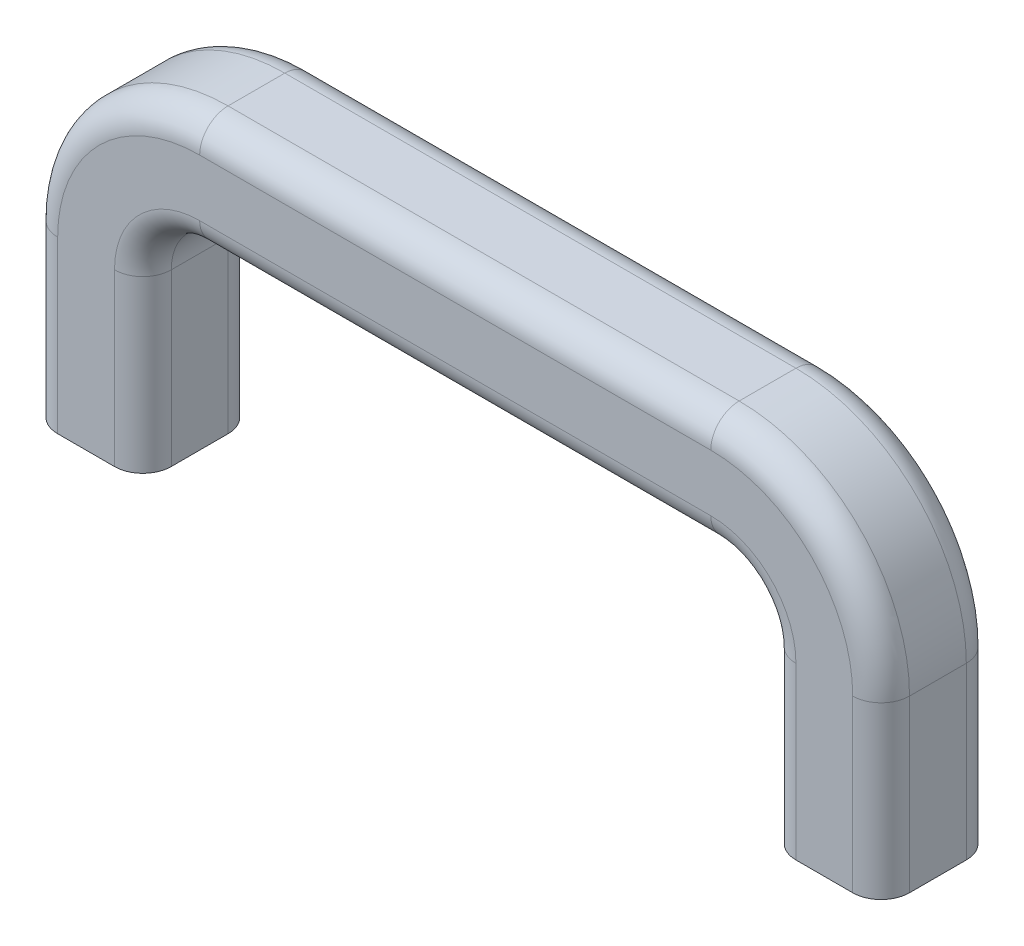
ISO-10303-21;
HEADER;
FILE_DESCRIPTION(('STEP AP214'),'2;1');
FILE_NAME('part.step','',(''),(''),'','','');
FILE_SCHEMA(('AUTOMOTIVE_DESIGN { 1 0 10303 214 1 1 1 1 }'));
ENDSEC;
DATA;
#1=APPLICATION_CONTEXT('core data for automotive mechanical design processes');
#2=APPLICATION_PROTOCOL_DEFINITION('international standard','automotive_design',2000,#1);
#3=PRODUCT_CONTEXT('',#1,'mechanical');
#4=PRODUCT('Part','Part','',(#3));
#5=PRODUCT_RELATED_PRODUCT_CATEGORY('part','',(#4));
#6=PRODUCT_DEFINITION_FORMATION('','',#4);
#7=PRODUCT_DEFINITION_CONTEXT('part definition',#1,'design');
#8=PRODUCT_DEFINITION('design','',#6,#7);
#9=PRODUCT_DEFINITION_SHAPE('','',#8);
#10=(LENGTH_UNIT() NAMED_UNIT(*) SI_UNIT(.MILLI.,.METRE.));
#11=(NAMED_UNIT(*) PLANE_ANGLE_UNIT() SI_UNIT($,.RADIAN.));
#12=(NAMED_UNIT(*) SI_UNIT($,.STERADIAN.) SOLID_ANGLE_UNIT());
#13=UNCERTAINTY_MEASURE_WITH_UNIT(LENGTH_MEASURE(1.E-05),#10,'distance_accuracy_value','');
#14=(GEOMETRIC_REPRESENTATION_CONTEXT(3) GLOBAL_UNCERTAINTY_ASSIGNED_CONTEXT((#13)) GLOBAL_UNIT_ASSIGNED_CONTEXT((#10,
#11,#12)) REPRESENTATION_CONTEXT('',''));
#15=CARTESIAN_POINT('',(0.,0.,0.));
#16=DIRECTION('',(0.,0.,1.));
#17=DIRECTION('',(1.,0.,0.));
#18=AXIS2_PLACEMENT_3D('',#15,#16,#17);
#19=CARTESIAN_POINT('',(0.,0.,0.));
#20=DIRECTION('',(0.,1.,0.));
#21=DIRECTION('',(0.,0.,1.));
#22=AXIS2_PLACEMENT_3D('',#19,#20,#21);
#23=PLANE('',#22);
#24=DIRECTION('',(-1.,0.,0.));
#25=VECTOR('',#24,1.);
#26=CARTESIAN_POINT('',(75.,0.,-10.));
#27=LINE('',#26,#25);
#28=CARTESIAN_POINT('',(-60.,0.,-9.99999999999999));
#29=VERTEX_POINT('',#28);
#30=CARTESIAN_POINT('',(-70.,0.,-9.99999999999999));
#31=VERTEX_POINT('',#30);
#32=EDGE_CURVE('E226',#29,#31,#27,.T.);
#33=ORIENTED_EDGE('',*,*,#32,.F.);
#34=CARTESIAN_POINT('',(-60.,0.,-4.99999999999999));
#35=DIRECTION('',(0.,1.,0.));
#36=DIRECTION('',(0.,0.,1.));
#37=AXIS2_PLACEMENT_3D('',#34,#35,#36);
#38=CIRCLE('',#37,5.);
#39=CARTESIAN_POINT('',(-55.,0.,-4.99999999999999));
#40=VERTEX_POINT('',#39);
#41=EDGE_CURVE('E293',#29,#40,#38,.F.);
#42=ORIENTED_EDGE('',*,*,#41,.T.);
#43=DIRECTION('',(0.,0.,1.));
#44=VECTOR('',#43,1.);
#45=CARTESIAN_POINT('',(-55.,0.,0.));
#46=LINE('',#45,#44);
#47=CARTESIAN_POINT('',(-55.,0.,5.));
#48=VERTEX_POINT('',#47);
#49=EDGE_CURVE('E228',#40,#48,#46,.T.);
#50=ORIENTED_EDGE('',*,*,#49,.T.);
#51=CARTESIAN_POINT('',(-60.,0.,5.));
#52=DIRECTION('',(0.,1.,0.));
#53=DIRECTION('',(0.,0.,1.));
#54=AXIS2_PLACEMENT_3D('',#51,#52,#53);
#55=CIRCLE('',#54,5.);
#56=CARTESIAN_POINT('',(-60.,0.,10.));
#57=VERTEX_POINT('',#56);
#58=EDGE_CURVE('E291',#48,#57,#55,.F.);
#59=ORIENTED_EDGE('',*,*,#58,.T.);
#60=DIRECTION('',(1.,0.,0.));
#61=VECTOR('',#60,1.);
#62=CARTESIAN_POINT('',(75.,0.,9.99999999999999));
#63=LINE('',#62,#61);
#64=CARTESIAN_POINT('',(-70.,0.,10.));
#65=VERTEX_POINT('',#64);
#66=EDGE_CURVE('E403',#65,#57,#63,.T.);
#67=ORIENTED_EDGE('',*,*,#66,.F.);
#68=CARTESIAN_POINT('',(-70.,0.,5.00000000000001));
#69=DIRECTION('',(0.,1.,0.));
#70=DIRECTION('',(0.,0.,1.));
#71=AXIS2_PLACEMENT_3D('',#68,#69,#70);
#72=CIRCLE('',#71,5.);
#73=CARTESIAN_POINT('',(-75.,0.,5.00000000000001));
#74=VERTEX_POINT('',#73);
#75=EDGE_CURVE('E287',#65,#74,#72,.F.);
#76=ORIENTED_EDGE('',*,*,#75,.T.);
#77=DIRECTION('',(0.,0.,1.));
#78=VECTOR('',#77,1.);
#79=CARTESIAN_POINT('',(-75.,0.,10.));
#80=LINE('',#79,#78);
#81=CARTESIAN_POINT('',(-75.,0.,-4.99999999999999));
#82=VERTEX_POINT('',#81);
#83=EDGE_CURVE('E355',#82,#74,#80,.T.);
#84=ORIENTED_EDGE('',*,*,#83,.F.);
#85=CARTESIAN_POINT('',(-70.,0.,-4.99999999999999));
#86=DIRECTION('',(0.,1.,0.));
#87=DIRECTION('',(0.,0.,1.));
#88=AXIS2_PLACEMENT_3D('',#85,#86,#87);
#89=CIRCLE('',#88,5.);
#90=EDGE_CURVE('E289',#82,#31,#89,.F.);
#91=ORIENTED_EDGE('',*,*,#90,.T.);
#92=EDGE_LOOP('',(#33,#42,#50,#59,#67,#76,#84,#91));
#93=FACE_BOUND('',#92,.T.);
#94=ADVANCED_FACE('F34',(#93),#23,.F.);
#95=CARTESIAN_POINT('',(-75.,60.,10.));
#96=DIRECTION('',(1.,0.,0.));
#97=DIRECTION('',(0.,0.,-1.));
#98=AXIS2_PLACEMENT_3D('',#95,#96,#97);
#99=PLANE('',#98);
#100=DIRECTION('',(0.,0.,1.));
#101=VECTOR('',#100,1.);
#102=CARTESIAN_POINT('',(-75.,30.,-9.99999999999999));
#103=LINE('',#102,#101);
#104=CARTESIAN_POINT('',(-75.,30.,5.00000000000001));
#105=VERTEX_POINT('',#104);
#106=CARTESIAN_POINT('',(-75.,30.,-4.99999999999999));
#107=VERTEX_POINT('',#106);
#108=EDGE_CURVE('E256',#105,#107,#103,.F.);
#109=ORIENTED_EDGE('',*,*,#108,.T.);
#110=DIRECTION('',(0.,-1.,0.));
#111=VECTOR('',#110,1.);
#112=CARTESIAN_POINT('',(-75.,60.,-4.99999999999999));
#113=LINE('',#112,#111);
#114=EDGE_CURVE('E333',#107,#82,#113,.T.);
#115=ORIENTED_EDGE('',*,*,#114,.T.);
#116=ORIENTED_EDGE('',*,*,#83,.T.);
#117=DIRECTION('',(0.,-1.,0.));
#118=VECTOR('',#117,1.);
#119=CARTESIAN_POINT('',(-75.,60.,5.00000000000001));
#120=LINE('',#119,#118);
#121=EDGE_CURVE('E331',#74,#105,#120,.F.);
#122=ORIENTED_EDGE('',*,*,#121,.T.);
#123=EDGE_LOOP('',(#109,#115,#116,#122));
#124=FACE_BOUND('',#123,.T.);
#125=ADVANCED_FACE('F414',(#124),#99,.F.);
#126=CARTESIAN_POINT('',(75.,60.,9.99999999999999));
#127=DIRECTION('',(0.,0.,-1.));
#128=DIRECTION('',(-1.,0.,0.));
#129=AXIS2_PLACEMENT_3D('',#126,#127,#128);
#130=PLANE('',#129);
#131=CARTESIAN_POINT('',(45.,30.,9.99999999999999));
#132=DIRECTION('',(0.,0.,-1.));
#133=DIRECTION('',(-1.,0.,0.));
#134=AXIS2_PLACEMENT_3D('',#131,#132,#133);
#135=CIRCLE('',#134,15.);
#136=CARTESIAN_POINT('',(45.,45.,9.99999999999999));
#137=VERTEX_POINT('',#136);
#138=CARTESIAN_POINT('',(60.,30.,9.99999999999999));
#139=VERTEX_POINT('',#138);
#140=EDGE_CURVE('E320',#137,#139,#135,.T.);
#141=ORIENTED_EDGE('',*,*,#140,.T.);
#142=DIRECTION('',(0.,1.,0.));
#143=VECTOR('',#142,1.);
#144=CARTESIAN_POINT('',(60.,60.,9.99999999999999));
#145=LINE('',#144,#143);
#146=CARTESIAN_POINT('',(60.,0.,9.99999999999999));
#147=VERTEX_POINT('',#146);
#148=EDGE_CURVE('E322',#139,#147,#145,.F.);
#149=ORIENTED_EDGE('',*,*,#148,.T.);
#150=CARTESIAN_POINT('',(70.,0.,9.99999999999999));
#151=VERTEX_POINT('',#150);
#152=EDGE_CURVE('E405',#147,#151,#63,.T.);
#153=ORIENTED_EDGE('',*,*,#152,.T.);
#154=DIRECTION('',(0.,-1.,0.));
#155=VECTOR('',#154,1.);
#156=CARTESIAN_POINT('',(70.,60.,9.99999999999999));
#157=LINE('',#156,#155);
#158=CARTESIAN_POINT('',(70.,30.,9.99999999999999));
#159=VERTEX_POINT('',#158);
#160=EDGE_CURVE('E307',#151,#159,#157,.F.);
#161=ORIENTED_EDGE('',*,*,#160,.T.);
#162=CARTESIAN_POINT('',(45.,30.,9.99999999999999));
#163=DIRECTION('',(0.,0.,-1.));
#164=DIRECTION('',(-1.,0.,0.));
#165=AXIS2_PLACEMENT_3D('',#162,#163,#164);
#166=CIRCLE('',#165,25.);
#167=CARTESIAN_POINT('',(45.,55.,9.99999999999999));
#168=VERTEX_POINT('',#167);
#169=EDGE_CURVE('E305',#159,#168,#166,.F.);
#170=ORIENTED_EDGE('',*,*,#169,.T.);
#171=DIRECTION('',(1.,0.,0.));
#172=VECTOR('',#171,1.);
#173=CARTESIAN_POINT('',(-45.,55.,10.));
#174=LINE('',#173,#172);
#175=CARTESIAN_POINT('',(-45.,55.,10.));
#176=VERTEX_POINT('',#175);
#177=EDGE_CURVE('E303',#168,#176,#174,.F.);
#178=ORIENTED_EDGE('',*,*,#177,.T.);
#179=CARTESIAN_POINT('',(-45.,30.,10.));
#180=DIRECTION('',(0.,0.,-1.));
#181=DIRECTION('',(-1.,0.,0.));
#182=AXIS2_PLACEMENT_3D('',#179,#180,#181);
#183=CIRCLE('',#182,25.);
#184=CARTESIAN_POINT('',(-70.,30.,10.));
#185=VERTEX_POINT('',#184);
#186=EDGE_CURVE('E309',#176,#185,#183,.F.);
#187=ORIENTED_EDGE('',*,*,#186,.T.);
#188=DIRECTION('',(0.,-1.,0.));
#189=VECTOR('',#188,1.);
#190=CARTESIAN_POINT('',(-70.,60.,10.));
#191=LINE('',#190,#189);
#192=EDGE_CURVE('E311',#185,#65,#191,.T.);
#193=ORIENTED_EDGE('',*,*,#192,.T.);
#194=ORIENTED_EDGE('',*,*,#66,.T.);
#195=DIRECTION('',(0.,-1.,0.));
#196=VECTOR('',#195,1.);
#197=CARTESIAN_POINT('',(-60.,60.,10.));
#198=LINE('',#197,#196);
#199=CARTESIAN_POINT('',(-60.,30.,10.));
#200=VERTEX_POINT('',#199);
#201=EDGE_CURVE('E318',#57,#200,#198,.F.);
#202=ORIENTED_EDGE('',*,*,#201,.T.);
#203=CARTESIAN_POINT('',(-45.,30.,10.));
#204=DIRECTION('',(0.,0.,-1.));
#205=DIRECTION('',(-1.,0.,0.));
#206=AXIS2_PLACEMENT_3D('',#203,#204,#205);
#207=CIRCLE('',#206,15.);
#208=CARTESIAN_POINT('',(-45.,45.,10.));
#209=VERTEX_POINT('',#208);
#210=EDGE_CURVE('E316',#200,#209,#207,.T.);
#211=ORIENTED_EDGE('',*,*,#210,.T.);
#212=DIRECTION('',(-1.,0.,0.));
#213=VECTOR('',#212,1.);
#214=CARTESIAN_POINT('',(75.,45.,9.99999999999999));
#215=LINE('',#214,#213);
#216=EDGE_CURVE('E314',#209,#137,#215,.F.);
#217=ORIENTED_EDGE('',*,*,#216,.T.);
#218=EDGE_LOOP('',(#141,#149,#153,#161,#170,#178,#187,#193,#194,#202,#211,#217));
#219=FACE_BOUND('',#218,.T.);
#220=ADVANCED_FACE('F481',(#219),#130,.F.);
#221=CARTESIAN_POINT('',(75.,60.,9.99999999999999));
#222=DIRECTION('',(-1.,0.,0.));
#223=DIRECTION('',(0.,0.,1.));
#224=AXIS2_PLACEMENT_3D('',#221,#222,#223);
#225=PLANE('',#224);
#226=DIRECTION('',(0.,0.,-1.));
#227=VECTOR('',#226,1.);
#228=CARTESIAN_POINT('',(75.,0.,9.99999999999999));
#229=LINE('',#228,#227);
#230=CARTESIAN_POINT('',(75.,0.,4.99999999999999));
#231=VERTEX_POINT('',#230);
#232=CARTESIAN_POINT('',(75.,0.,-5.00000000000001));
#233=VERTEX_POINT('',#232);
#234=EDGE_CURVE('E231',#231,#233,#229,.T.);
#235=ORIENTED_EDGE('',*,*,#234,.T.);
#236=DIRECTION('',(0.,-1.,0.));
#237=VECTOR('',#236,1.);
#238=CARTESIAN_POINT('',(75.,60.,-5.00000000000001));
#239=LINE('',#238,#237);
#240=CARTESIAN_POINT('',(75.,30.,-5.00000000000001));
#241=VERTEX_POINT('',#240);
#242=EDGE_CURVE('E202',#233,#241,#239,.F.);
#243=ORIENTED_EDGE('',*,*,#242,.T.);
#244=DIRECTION('',(0.,0.,-1.));
#245=VECTOR('',#244,1.);
#246=CARTESIAN_POINT('',(75.,30.,9.99999999999999));
#247=LINE('',#246,#245);
#248=CARTESIAN_POINT('',(75.,30.,4.99999999999999));
#249=VERTEX_POINT('',#248);
#250=EDGE_CURVE('E253',#241,#249,#247,.F.);
#251=ORIENTED_EDGE('',*,*,#250,.T.);
#252=DIRECTION('',(0.,-1.,0.));
#253=VECTOR('',#252,1.);
#254=CARTESIAN_POINT('',(75.,60.,4.99999999999999));
#255=LINE('',#254,#253);
#256=EDGE_CURVE('E324',#249,#231,#255,.T.);
#257=ORIENTED_EDGE('',*,*,#256,.T.);
#258=EDGE_LOOP('',(#235,#243,#251,#257));
#259=FACE_BOUND('',#258,.T.);
#260=ADVANCED_FACE('F399',(#259),#225,.F.);
#261=CARTESIAN_POINT('',(75.,60.,-10.));
#262=DIRECTION('',(0.,0.,1.));
#263=DIRECTION('',(1.,0.,0.));
#264=AXIS2_PLACEMENT_3D('',#261,#262,#263);
#265=PLANE('',#264);
#266=CARTESIAN_POINT('',(70.,0.,-10.));
#267=VERTEX_POINT('',#266);
#268=CARTESIAN_POINT('',(60.,0.,-10.));
#269=VERTEX_POINT('',#268);
#270=EDGE_CURVE('E214',#267,#269,#27,.T.);
#271=ORIENTED_EDGE('',*,*,#270,.T.);
#272=DIRECTION('',(0.,1.,0.));
#273=VECTOR('',#272,1.);
#274=CARTESIAN_POINT('',(60.,60.,-10.));
#275=LINE('',#274,#273);
#276=CARTESIAN_POINT('',(60.,30.,-10.));
#277=VERTEX_POINT('',#276);
#278=EDGE_CURVE('E273',#269,#277,#275,.T.);
#279=ORIENTED_EDGE('',*,*,#278,.T.);
#280=CARTESIAN_POINT('',(45.,30.,-10.));
#281=DIRECTION('',(0.,0.,1.));
#282=DIRECTION('',(1.,0.,0.));
#283=AXIS2_PLACEMENT_3D('',#280,#281,#282);
#284=CIRCLE('',#283,15.);
#285=CARTESIAN_POINT('',(45.,45.,-10.));
#286=VERTEX_POINT('',#285);
#287=EDGE_CURVE('E271',#277,#286,#284,.T.);
#288=ORIENTED_EDGE('',*,*,#287,.T.);
#289=DIRECTION('',(-1.,0.,0.));
#290=VECTOR('',#289,1.);
#291=CARTESIAN_POINT('',(75.,45.,-10.));
#292=LINE('',#291,#290);
#293=CARTESIAN_POINT('',(-45.,45.,-10.));
#294=VERTEX_POINT('',#293);
#295=EDGE_CURVE('E219',#286,#294,#292,.T.);
#296=ORIENTED_EDGE('',*,*,#295,.T.);
#297=CARTESIAN_POINT('',(-45.,30.,-10.));
#298=DIRECTION('',(0.,0.,1.));
#299=DIRECTION('',(1.,0.,0.));
#300=AXIS2_PLACEMENT_3D('',#297,#298,#299);
#301=CIRCLE('',#300,15.);
#302=CARTESIAN_POINT('',(-60.,30.,-9.99999999999999));
#303=VERTEX_POINT('',#302);
#304=EDGE_CURVE('E267',#294,#303,#301,.T.);
#305=ORIENTED_EDGE('',*,*,#304,.T.);
#306=DIRECTION('',(0.,-1.,0.));
#307=VECTOR('',#306,1.);
#308=CARTESIAN_POINT('',(-60.,60.,-9.99999999999999));
#309=LINE('',#308,#307);
#310=EDGE_CURVE('E269',#303,#29,#309,.T.);
#311=ORIENTED_EDGE('',*,*,#310,.T.);
#312=ORIENTED_EDGE('',*,*,#32,.T.);
#313=DIRECTION('',(0.,-1.,0.));
#314=VECTOR('',#313,1.);
#315=CARTESIAN_POINT('',(-70.,60.,-9.99999999999999));
#316=LINE('',#315,#314);
#317=CARTESIAN_POINT('',(-70.,30.,-9.99999999999999));
#318=VERTEX_POINT('',#317);
#319=EDGE_CURVE('E263',#31,#318,#316,.F.);
#320=ORIENTED_EDGE('',*,*,#319,.T.);
#321=CARTESIAN_POINT('',(-45.,30.,-10.));
#322=DIRECTION('',(0.,0.,1.));
#323=DIRECTION('',(1.,0.,0.));
#324=AXIS2_PLACEMENT_3D('',#321,#322,#323);
#325=CIRCLE('',#324,25.);
#326=CARTESIAN_POINT('',(-45.,55.,-10.));
#327=VERTEX_POINT('',#326);
#328=EDGE_CURVE('E261',#318,#327,#325,.F.);
#329=ORIENTED_EDGE('',*,*,#328,.T.);
#330=DIRECTION('',(-1.,0.,0.));
#331=VECTOR('',#330,1.);
#332=CARTESIAN_POINT('',(45.,55.,-10.));
#333=LINE('',#332,#331);
#334=CARTESIAN_POINT('',(45.,55.,-10.));
#335=VERTEX_POINT('',#334);
#336=EDGE_CURVE('E259',#327,#335,#333,.F.);
#337=ORIENTED_EDGE('',*,*,#336,.T.);
#338=CARTESIAN_POINT('',(45.,30.,-10.));
#339=DIRECTION('',(0.,0.,1.));
#340=DIRECTION('',(1.,0.,0.));
#341=AXIS2_PLACEMENT_3D('',#338,#339,#340);
#342=CIRCLE('',#341,25.);
#343=CARTESIAN_POINT('',(70.,30.,-10.));
#344=VERTEX_POINT('',#343);
#345=EDGE_CURVE('E217',#335,#344,#342,.F.);
#346=ORIENTED_EDGE('',*,*,#345,.T.);
#347=DIRECTION('',(0.,-1.,0.));
#348=VECTOR('',#347,1.);
#349=CARTESIAN_POINT('',(70.,60.,-10.));
#350=LINE('',#349,#348);
#351=EDGE_CURVE('E201',#344,#267,#350,.T.);
#352=ORIENTED_EDGE('',*,*,#351,.T.);
#353=EDGE_LOOP('',(#271,#279,#288,#296,#305,#311,#312,#320,#329,#337,#346,#352));
#354=FACE_BOUND('',#353,.T.);
#355=ADVANCED_FACE('F212',(#354),#265,.F.);
#356=CARTESIAN_POINT('',(0.,60.,0.));
#357=DIRECTION('',(0.,1.,0.));
#358=DIRECTION('',(0.,0.,1.));
#359=AXIS2_PLACEMENT_3D('',#356,#357,#358);
#360=PLANE('',#359);
#361=DIRECTION('',(0.,0.,-1.));
#362=VECTOR('',#361,1.);
#363=CARTESIAN_POINT('',(45.,60.,-10.));
#364=LINE('',#363,#362);
#365=CARTESIAN_POINT('',(45.,60.,4.99999999999999));
#366=VERTEX_POINT('',#365);
#367=CARTESIAN_POINT('',(45.,60.,-5.00000000000001));
#368=VERTEX_POINT('',#367);
#369=EDGE_CURVE('E251',#366,#368,#364,.T.);
#370=ORIENTED_EDGE('',*,*,#369,.T.);
#371=DIRECTION('',(-1.,0.,0.));
#372=VECTOR('',#371,1.);
#373=CARTESIAN_POINT('',(-45.,60.,-5.));
#374=LINE('',#373,#372);
#375=CARTESIAN_POINT('',(-45.,60.,-5.));
#376=VERTEX_POINT('',#375);
#377=EDGE_CURVE('E11',#368,#376,#374,.T.);
#378=ORIENTED_EDGE('',*,*,#377,.T.);
#379=DIRECTION('',(0.,0.,1.));
#380=VECTOR('',#379,1.);
#381=CARTESIAN_POINT('',(-45.,60.,10.));
#382=LINE('',#381,#380);
#383=CARTESIAN_POINT('',(-45.,60.,5.));
#384=VERTEX_POINT('',#383);
#385=EDGE_CURVE('E249',#376,#384,#382,.T.);
#386=ORIENTED_EDGE('',*,*,#385,.T.);
#387=DIRECTION('',(1.,0.,0.));
#388=VECTOR('',#387,1.);
#389=CARTESIAN_POINT('',(45.,60.,4.99999999999999));
#390=LINE('',#389,#388);
#391=EDGE_CURVE('E43',#384,#366,#390,.T.);
#392=ORIENTED_EDGE('',*,*,#391,.T.);
#393=EDGE_LOOP('',(#370,#378,#386,#392));
#394=FACE_BOUND('',#393,.T.);
#395=ADVANCED_FACE('F428',(#394),#360,.T.);
#396=DIRECTION('',(0.,0.,-1.));
#397=VECTOR('',#396,1.);
#398=CARTESIAN_POINT('',(55.,0.,0.));
#399=LINE('',#398,#397);
#400=CARTESIAN_POINT('',(55.,0.,4.99999999999999));
#401=VERTEX_POINT('',#400);
#402=CARTESIAN_POINT('',(55.,0.,-5.00000000000001));
#403=VERTEX_POINT('',#402);
#404=EDGE_CURVE('E225',#401,#403,#399,.T.);
#405=ORIENTED_EDGE('',*,*,#404,.T.);
#406=CARTESIAN_POINT('',(60.,0.,-5.00000000000001));
#407=DIRECTION('',(0.,1.,0.));
#408=DIRECTION('',(0.,0.,1.));
#409=AXIS2_PLACEMENT_3D('',#406,#407,#408);
#410=CIRCLE('',#409,5.);
#411=EDGE_CURVE('E224',#403,#269,#410,.F.);
#412=ORIENTED_EDGE('',*,*,#411,.T.);
#413=ORIENTED_EDGE('',*,*,#270,.F.);
#414=CARTESIAN_POINT('',(70.,0.,-5.00000000000001));
#415=DIRECTION('',(0.,1.,0.));
#416=DIRECTION('',(0.,0.,1.));
#417=AXIS2_PLACEMENT_3D('',#414,#415,#416);
#418=CIRCLE('',#417,5.);
#419=EDGE_CURVE('E197',#267,#233,#418,.F.);
#420=ORIENTED_EDGE('',*,*,#419,.T.);
#421=ORIENTED_EDGE('',*,*,#234,.F.);
#422=CARTESIAN_POINT('',(70.,0.,4.99999999999999));
#423=DIRECTION('',(0.,1.,0.));
#424=DIRECTION('',(0.,0.,1.));
#425=AXIS2_PLACEMENT_3D('',#422,#423,#424);
#426=CIRCLE('',#425,5.);
#427=EDGE_CURVE('E208',#231,#151,#426,.F.);
#428=ORIENTED_EDGE('',*,*,#427,.T.);
#429=ORIENTED_EDGE('',*,*,#152,.F.);
#430=CARTESIAN_POINT('',(60.,0.,4.99999999999999));
#431=DIRECTION('',(0.,1.,0.));
#432=DIRECTION('',(0.,0.,1.));
#433=AXIS2_PLACEMENT_3D('',#430,#431,#432);
#434=CIRCLE('',#433,5.);
#435=EDGE_CURVE('E207',#147,#401,#434,.F.);
#436=ORIENTED_EDGE('',*,*,#435,.T.);
#437=EDGE_LOOP('',(#405,#412,#413,#420,#421,#428,#429,#436));
#438=FACE_BOUND('',#437,.T.);
#439=ADVANCED_FACE('F222',(#438),#23,.F.);
#440=CARTESIAN_POINT('',(-55.,40.,-50.));
#441=DIRECTION('',(0.,1.,0.));
#442=DIRECTION('',(0.,0.,1.));
#443=AXIS2_PLACEMENT_3D('',#440,#441,#442);
#444=PLANE('',#443);
#445=DIRECTION('',(0.,0.,1.));
#446=VECTOR('',#445,1.);
#447=CARTESIAN_POINT('',(-45.,40.,-10.));
#448=LINE('',#447,#446);
#449=CARTESIAN_POINT('',(-45.,40.,5.));
#450=VERTEX_POINT('',#449);
#451=CARTESIAN_POINT('',(-45.,40.,-5.));
#452=VERTEX_POINT('',#451);
#453=EDGE_CURVE('E237',#450,#452,#448,.F.);
#454=ORIENTED_EDGE('',*,*,#453,.T.);
#455=DIRECTION('',(-1.,0.,0.));
#456=VECTOR('',#455,1.);
#457=CARTESIAN_POINT('',(-55.,40.,-4.99999999999999));
#458=LINE('',#457,#456);
#459=CARTESIAN_POINT('',(45.,40.,-5.00000000000001));
#460=VERTEX_POINT('',#459);
#461=EDGE_CURVE('E340',#452,#460,#458,.F.);
#462=ORIENTED_EDGE('',*,*,#461,.T.);
#463=DIRECTION('',(0.,0.,1.));
#464=VECTOR('',#463,1.);
#465=CARTESIAN_POINT('',(45.,40.,9.99999999999999));
#466=LINE('',#465,#464);
#467=CARTESIAN_POINT('',(45.,40.,4.99999999999999));
#468=VERTEX_POINT('',#467);
#469=EDGE_CURVE('E240',#460,#468,#466,.T.);
#470=ORIENTED_EDGE('',*,*,#469,.T.);
#471=DIRECTION('',(-1.,0.,0.));
#472=VECTOR('',#471,1.);
#473=CARTESIAN_POINT('',(-55.,40.,5.));
#474=LINE('',#473,#472);
#475=EDGE_CURVE('E338',#468,#450,#474,.T.);
#476=ORIENTED_EDGE('',*,*,#475,.T.);
#477=EDGE_LOOP('',(#454,#462,#470,#476));
#478=FACE_BOUND('',#477,.T.);
#479=ADVANCED_FACE('F467',(#478),#444,.F.);
#480=CARTESIAN_POINT('',(-55.,0.,-50.));
#481=DIRECTION('',(-1.,0.,0.));
#482=DIRECTION('',(0.,0.,1.));
#483=AXIS2_PLACEMENT_3D('',#480,#481,#482);
#484=PLANE('',#483);
#485=ORIENTED_EDGE('',*,*,#49,.F.);
#486=DIRECTION('',(0.,-1.,0.));
#487=VECTOR('',#486,1.);
#488=CARTESIAN_POINT('',(-55.,0.,-5.));
#489=LINE('',#488,#487);
#490=CARTESIAN_POINT('',(-55.,30.,-5.));
#491=VERTEX_POINT('',#490);
#492=EDGE_CURVE('E297',#40,#491,#489,.F.);
#493=ORIENTED_EDGE('',*,*,#492,.T.);
#494=DIRECTION('',(0.,0.,1.));
#495=VECTOR('',#494,1.);
#496=CARTESIAN_POINT('',(-55.,30.,9.99999999999999));
#497=LINE('',#496,#495);
#498=CARTESIAN_POINT('',(-55.,30.,5.00000000000001));
#499=VERTEX_POINT('',#498);
#500=EDGE_CURVE('E246',#491,#499,#497,.T.);
#501=ORIENTED_EDGE('',*,*,#500,.T.);
#502=DIRECTION('',(0.,-1.,0.));
#503=VECTOR('',#502,1.);
#504=CARTESIAN_POINT('',(-55.,0.,5.));
#505=LINE('',#504,#503);
#506=EDGE_CURVE('E295',#499,#48,#505,.T.);
#507=ORIENTED_EDGE('',*,*,#506,.T.);
#508=EDGE_LOOP('',(#485,#493,#501,#507));
#509=FACE_BOUND('',#508,.T.);
#510=ADVANCED_FACE('F523',(#509),#484,.F.);
#511=CARTESIAN_POINT('',(55.,0.,-50.));
#512=DIRECTION('',(1.,0.,0.));
#513=DIRECTION('',(0.,0.,-1.));
#514=AXIS2_PLACEMENT_3D('',#511,#512,#513);
#515=PLANE('',#514);
#516=DIRECTION('',(0.,0.,1.));
#517=VECTOR('',#516,1.);
#518=CARTESIAN_POINT('',(55.,30.,-10.));
#519=LINE('',#518,#517);
#520=CARTESIAN_POINT('',(55.,30.,5.));
#521=VERTEX_POINT('',#520);
#522=CARTESIAN_POINT('',(55.,30.,-5.00000000000001));
#523=VERTEX_POINT('',#522);
#524=EDGE_CURVE('E243',#521,#523,#519,.F.);
#525=ORIENTED_EDGE('',*,*,#524,.T.);
#526=DIRECTION('',(0.,1.,0.));
#527=VECTOR('',#526,1.);
#528=CARTESIAN_POINT('',(55.,0.,-5.00000000000001));
#529=LINE('',#528,#527);
#530=EDGE_CURVE('E278',#523,#403,#529,.F.);
#531=ORIENTED_EDGE('',*,*,#530,.T.);
#532=ORIENTED_EDGE('',*,*,#404,.F.);
#533=DIRECTION('',(0.,1.,0.));
#534=VECTOR('',#533,1.);
#535=CARTESIAN_POINT('',(55.,0.,4.99999999999999));
#536=LINE('',#535,#534);
#537=EDGE_CURVE('E275',#401,#521,#536,.T.);
#538=ORIENTED_EDGE('',*,*,#537,.T.);
#539=EDGE_LOOP('',(#525,#531,#532,#538));
#540=FACE_BOUND('',#539,.T.);
#541=ADVANCED_FACE('F488',(#540),#515,.F.);
#542=CARTESIAN_POINT('',(45.,30.,-50.));
#543=DIRECTION('',(0.,0.,-1.));
#544=DIRECTION('',(-1.,0.,0.));
#545=AXIS2_PLACEMENT_3D('',#542,#543,#544);
#546=CYLINDRICAL_SURFACE('',#545,10.);
#547=ORIENTED_EDGE('',*,*,#469,.F.);
#548=CARTESIAN_POINT('',(45.,30.,-5.));
#549=DIRECTION('',(0.,0.,1.));
#550=DIRECTION('',(1.,0.,0.));
#551=AXIS2_PLACEMENT_3D('',#548,#549,#550);
#552=CIRCLE('',#551,10.);
#553=EDGE_CURVE('E285',#460,#523,#552,.F.);
#554=ORIENTED_EDGE('',*,*,#553,.T.);
#555=ORIENTED_EDGE('',*,*,#524,.F.);
#556=CARTESIAN_POINT('',(45.,30.,5.));
#557=DIRECTION('',(0.,0.,-1.));
#558=DIRECTION('',(-1.,0.,0.));
#559=AXIS2_PLACEMENT_3D('',#556,#557,#558);
#560=CIRCLE('',#559,10.);
#561=EDGE_CURVE('E283',#521,#468,#560,.F.);
#562=ORIENTED_EDGE('',*,*,#561,.T.);
#563=EDGE_LOOP('',(#547,#554,#555,#562));
#564=FACE_BOUND('',#563,.T.);
#565=ADVANCED_FACE('F533',(#564),#546,.F.);
#566=CARTESIAN_POINT('',(-45.,30.,-50.));
#567=DIRECTION('',(0.,0.,-1.));
#568=DIRECTION('',(-1.,0.,0.));
#569=AXIS2_PLACEMENT_3D('',#566,#567,#568);
#570=CYLINDRICAL_SURFACE('',#569,10.);
#571=ORIENTED_EDGE('',*,*,#500,.F.);
#572=CARTESIAN_POINT('',(-45.,30.,-5.));
#573=DIRECTION('',(0.,0.,1.));
#574=DIRECTION('',(1.,0.,0.));
#575=AXIS2_PLACEMENT_3D('',#572,#573,#574);
#576=CIRCLE('',#575,10.);
#577=EDGE_CURVE('E301',#491,#452,#576,.F.);
#578=ORIENTED_EDGE('',*,*,#577,.T.);
#579=ORIENTED_EDGE('',*,*,#453,.F.);
#580=CARTESIAN_POINT('',(-45.,30.,5.));
#581=DIRECTION('',(0.,0.,-1.));
#582=DIRECTION('',(-1.,0.,0.));
#583=AXIS2_PLACEMENT_3D('',#580,#581,#582);
#584=CIRCLE('',#583,10.);
#585=EDGE_CURVE('E299',#450,#499,#584,.F.);
#586=ORIENTED_EDGE('',*,*,#585,.T.);
#587=EDGE_LOOP('',(#571,#578,#579,#586));
#588=FACE_BOUND('',#587,.T.);
#589=ADVANCED_FACE('F464',(#588),#570,.F.);
#590=CARTESIAN_POINT('',(45.,30.,0.));
#591=DIRECTION('',(0.,0.,1.));
#592=DIRECTION('',(1.,0.,0.));
#593=AXIS2_PLACEMENT_3D('',#590,#591,#592);
#594=CYLINDRICAL_SURFACE('',#593,30.);
#595=ORIENTED_EDGE('',*,*,#250,.F.);
#596=CARTESIAN_POINT('',(45.,30.,-5.00000000000001));
#597=DIRECTION('',(0.,0.,1.));
#598=DIRECTION('',(1.,0.,0.));
#599=AXIS2_PLACEMENT_3D('',#596,#597,#598);
#600=CIRCLE('',#599,30.);
#601=EDGE_CURVE('E329',#241,#368,#600,.T.);
#602=ORIENTED_EDGE('',*,*,#601,.T.);
#603=ORIENTED_EDGE('',*,*,#369,.F.);
#604=CARTESIAN_POINT('',(45.,30.,4.99999999999999));
#605=DIRECTION('',(0.,0.,-1.));
#606=DIRECTION('',(-1.,0.,0.));
#607=AXIS2_PLACEMENT_3D('',#604,#605,#606);
#608=CIRCLE('',#607,30.);
#609=EDGE_CURVE('E327',#366,#249,#608,.T.);
#610=ORIENTED_EDGE('',*,*,#609,.T.);
#611=EDGE_LOOP('',(#595,#602,#603,#610));
#612=FACE_BOUND('',#611,.T.);
#613=ADVANCED_FACE('F430',(#612),#594,.T.);
#614=CARTESIAN_POINT('',(-45.,30.,0.));
#615=DIRECTION('',(0.,0.,-1.));
#616=DIRECTION('',(-1.,0.,0.));
#617=AXIS2_PLACEMENT_3D('',#614,#615,#616);
#618=CYLINDRICAL_SURFACE('',#617,30.);
#619=ORIENTED_EDGE('',*,*,#385,.F.);
#620=CARTESIAN_POINT('',(-45.,30.,-5.));
#621=DIRECTION('',(0.,0.,1.));
#622=DIRECTION('',(1.,0.,0.));
#623=AXIS2_PLACEMENT_3D('',#620,#621,#622);
#624=CIRCLE('',#623,30.);
#625=EDGE_CURVE('E336',#376,#107,#624,.T.);
#626=ORIENTED_EDGE('',*,*,#625,.T.);
#627=ORIENTED_EDGE('',*,*,#108,.F.);
#628=CARTESIAN_POINT('',(-45.,30.,5.));
#629=DIRECTION('',(0.,0.,-1.));
#630=DIRECTION('',(-1.,0.,0.));
#631=AXIS2_PLACEMENT_3D('',#628,#629,#630);
#632=CIRCLE('',#631,30.);
#633=EDGE_CURVE('E51',#105,#384,#632,.T.);
#634=ORIENTED_EDGE('',*,*,#633,.T.);
#635=EDGE_LOOP('',(#619,#626,#627,#634));
#636=FACE_BOUND('',#635,.T.);
#637=ADVANCED_FACE('F444',(#636),#618,.T.);
#638=CARTESIAN_POINT('',(-60.,60.,-4.99999999999999));
#639=DIRECTION('',(0.,-1.,0.));
#640=DIRECTION('',(0.,0.,-1.));
#641=AXIS2_PLACEMENT_3D('',#638,#639,#640);
#642=CYLINDRICAL_SURFACE('',#641,5.);
#643=ORIENTED_EDGE('',*,*,#41,.F.);
#644=ORIENTED_EDGE('',*,*,#310,.F.);
#645=CARTESIAN_POINT('',(-60.,30.,-4.99999999999999));
#646=DIRECTION('',(0.,1.,0.));
#647=DIRECTION('',(0.,0.,1.));
#648=AXIS2_PLACEMENT_3D('',#645,#646,#647);
#649=CIRCLE('',#648,5.);
#650=EDGE_CURVE('E352',#491,#303,#649,.T.);
#651=ORIENTED_EDGE('',*,*,#650,.F.);
#652=ORIENTED_EDGE('',*,*,#492,.F.);
#653=EDGE_LOOP('',(#643,#644,#651,#652));
#654=FACE_BOUND('',#653,.T.);
#655=ADVANCED_FACE('F454',(#654),#642,.T.);
#656=CARTESIAN_POINT('',(-45.,30.,-5.));
#657=DIRECTION('',(0.,0.,1.));
#658=DIRECTION('',(1.,0.,0.));
#659=AXIS2_PLACEMENT_3D('',#656,#657,#658);
#660=TOROIDAL_SURFACE('',#659,15.,5.);
#661=ORIENTED_EDGE('',*,*,#650,.T.);
#662=ORIENTED_EDGE('',*,*,#304,.F.);
#663=CARTESIAN_POINT('',(-45.,45.,-5.));
#664=DIRECTION('',(1.,0.,0.));
#665=DIRECTION('',(0.,0.,-1.));
#666=AXIS2_PLACEMENT_3D('',#663,#664,#665);
#667=CIRCLE('',#666,5.);
#668=EDGE_CURVE('E349',#452,#294,#667,.T.);
#669=ORIENTED_EDGE('',*,*,#668,.F.);
#670=ORIENTED_EDGE('',*,*,#577,.F.);
#671=EDGE_LOOP('',(#661,#662,#669,#670));
#672=FACE_BOUND('',#671,.T.);
#673=ADVANCED_FACE('F458',(#672),#660,.T.);
#674=CARTESIAN_POINT('',(75.,45.,-5.00000000000001));
#675=DIRECTION('',(-1.,0.,0.));
#676=DIRECTION('',(0.,0.,1.));
#677=AXIS2_PLACEMENT_3D('',#674,#675,#676);
#678=CYLINDRICAL_SURFACE('',#677,5.);
#679=ORIENTED_EDGE('',*,*,#668,.T.);
#680=ORIENTED_EDGE('',*,*,#295,.F.);
#681=CARTESIAN_POINT('',(45.,45.,-5.00000000000001));
#682=DIRECTION('',(1.,0.,0.));
#683=DIRECTION('',(0.,0.,-1.));
#684=AXIS2_PLACEMENT_3D('',#681,#682,#683);
#685=CIRCLE('',#684,5.);
#686=EDGE_CURVE('E345',#460,#286,#685,.T.);
#687=ORIENTED_EDGE('',*,*,#686,.F.);
#688=ORIENTED_EDGE('',*,*,#461,.F.);
#689=EDGE_LOOP('',(#679,#680,#687,#688));
#690=FACE_BOUND('',#689,.T.);
#691=ADVANCED_FACE('F501',(#690),#678,.T.);
#692=CARTESIAN_POINT('',(45.,30.,-5.));
#693=DIRECTION('',(0.,0.,1.));
#694=DIRECTION('',(1.,0.,0.));
#695=AXIS2_PLACEMENT_3D('',#692,#693,#694);
#696=TOROIDAL_SURFACE('',#695,15.,5.);
#697=ORIENTED_EDGE('',*,*,#686,.T.);
#698=ORIENTED_EDGE('',*,*,#287,.F.);
#699=CARTESIAN_POINT('',(60.,30.,-5.00000000000001));
#700=DIRECTION('',(0.,-1.,0.));
#701=DIRECTION('',(0.,0.,-1.));
#702=AXIS2_PLACEMENT_3D('',#699,#700,#701);
#703=CIRCLE('',#702,5.);
#704=EDGE_CURVE('E343',#523,#277,#703,.T.);
#705=ORIENTED_EDGE('',*,*,#704,.F.);
#706=ORIENTED_EDGE('',*,*,#553,.F.);
#707=EDGE_LOOP('',(#697,#698,#705,#706));
#708=FACE_BOUND('',#707,.T.);
#709=ADVANCED_FACE('F497',(#708),#696,.T.);
#710=CARTESIAN_POINT('',(60.,60.,-5.00000000000001));
#711=DIRECTION('',(0.,1.,0.));
#712=DIRECTION('',(0.,0.,1.));
#713=AXIS2_PLACEMENT_3D('',#710,#711,#712);
#714=CYLINDRICAL_SURFACE('',#713,5.);
#715=ORIENTED_EDGE('',*,*,#411,.F.);
#716=ORIENTED_EDGE('',*,*,#530,.F.);
#717=ORIENTED_EDGE('',*,*,#704,.T.);
#718=ORIENTED_EDGE('',*,*,#278,.F.);
#719=EDGE_LOOP('',(#715,#716,#717,#718));
#720=FACE_BOUND('',#719,.T.);
#721=ADVANCED_FACE('F493',(#720),#714,.T.);
#722=CARTESIAN_POINT('',(-60.,0.,5.));
#723=DIRECTION('',(0.,-1.,0.));
#724=DIRECTION('',(0.,0.,-1.));
#725=AXIS2_PLACEMENT_3D('',#722,#723,#724);
#726=CYLINDRICAL_SURFACE('',#725,5.);
#727=ORIENTED_EDGE('',*,*,#58,.F.);
#728=ORIENTED_EDGE('',*,*,#506,.F.);
#729=CARTESIAN_POINT('',(-60.,30.,5.00000000000001));
#730=DIRECTION('',(0.,1.,0.));
#731=DIRECTION('',(0.,0.,1.));
#732=AXIS2_PLACEMENT_3D('',#729,#730,#731);
#733=CIRCLE('',#732,5.);
#734=EDGE_CURVE('E346',#200,#499,#733,.T.);
#735=ORIENTED_EDGE('',*,*,#734,.F.);
#736=ORIENTED_EDGE('',*,*,#201,.F.);
#737=EDGE_LOOP('',(#727,#728,#735,#736));
#738=FACE_BOUND('',#737,.T.);
#739=ADVANCED_FACE('F550',(#738),#726,.T.);
#740=CARTESIAN_POINT('',(-45.,30.,5.));
#741=DIRECTION('',(0.,0.,-1.));
#742=DIRECTION('',(-1.,0.,0.));
#743=AXIS2_PLACEMENT_3D('',#740,#741,#742);
#744=TOROIDAL_SURFACE('',#743,15.,5.);
#745=ORIENTED_EDGE('',*,*,#734,.T.);
#746=ORIENTED_EDGE('',*,*,#585,.F.);
#747=CARTESIAN_POINT('',(-45.,45.,5.));
#748=DIRECTION('',(1.,0.,0.));
#749=DIRECTION('',(0.,0.,-1.));
#750=AXIS2_PLACEMENT_3D('',#747,#748,#749);
#751=CIRCLE('',#750,5.);
#752=EDGE_CURVE('E362',#209,#450,#751,.T.);
#753=ORIENTED_EDGE('',*,*,#752,.F.);
#754=ORIENTED_EDGE('',*,*,#210,.F.);
#755=EDGE_LOOP('',(#745,#746,#753,#754));
#756=FACE_BOUND('',#755,.T.);
#757=ADVANCED_FACE('F554',(#756),#744,.T.);
#758=CARTESIAN_POINT('',(-55.,45.,5.));
#759=DIRECTION('',(-1.,0.,0.));
#760=DIRECTION('',(0.,0.,1.));
#761=AXIS2_PLACEMENT_3D('',#758,#759,#760);
#762=CYLINDRICAL_SURFACE('',#761,5.);
#763=ORIENTED_EDGE('',*,*,#752,.T.);
#764=ORIENTED_EDGE('',*,*,#475,.F.);
#765=CARTESIAN_POINT('',(45.,45.,4.99999999999999));
#766=DIRECTION('',(1.,0.,0.));
#767=DIRECTION('',(0.,0.,-1.));
#768=AXIS2_PLACEMENT_3D('',#765,#766,#767);
#769=CIRCLE('',#768,5.);
#770=EDGE_CURVE('E358',#137,#468,#769,.T.);
#771=ORIENTED_EDGE('',*,*,#770,.F.);
#772=ORIENTED_EDGE('',*,*,#216,.F.);
#773=EDGE_LOOP('',(#763,#764,#771,#772));
#774=FACE_BOUND('',#773,.T.);
#775=ADVANCED_FACE('F472',(#774),#762,.T.);
#776=CARTESIAN_POINT('',(45.,30.,5.));
#777=DIRECTION('',(0.,0.,-1.));
#778=DIRECTION('',(-1.,0.,0.));
#779=AXIS2_PLACEMENT_3D('',#776,#777,#778);
#780=TOROIDAL_SURFACE('',#779,15.,5.);
#781=ORIENTED_EDGE('',*,*,#770,.T.);
#782=ORIENTED_EDGE('',*,*,#561,.F.);
#783=CARTESIAN_POINT('',(60.,30.,4.99999999999999));
#784=DIRECTION('',(0.,-1.,0.));
#785=DIRECTION('',(0.,0.,-1.));
#786=AXIS2_PLACEMENT_3D('',#783,#784,#785);
#787=CIRCLE('',#786,5.);
#788=EDGE_CURVE('E356',#139,#521,#787,.T.);
#789=ORIENTED_EDGE('',*,*,#788,.F.);
#790=ORIENTED_EDGE('',*,*,#140,.F.);
#791=EDGE_LOOP('',(#781,#782,#789,#790));
#792=FACE_BOUND('',#791,.T.);
#793=ADVANCED_FACE('F478',(#792),#780,.T.);
#794=CARTESIAN_POINT('',(60.,0.,4.99999999999999));
#795=DIRECTION('',(0.,1.,0.));
#796=DIRECTION('',(0.,0.,1.));
#797=AXIS2_PLACEMENT_3D('',#794,#795,#796);
#798=CYLINDRICAL_SURFACE('',#797,5.);
#799=ORIENTED_EDGE('',*,*,#435,.F.);
#800=ORIENTED_EDGE('',*,*,#148,.F.);
#801=ORIENTED_EDGE('',*,*,#788,.T.);
#802=ORIENTED_EDGE('',*,*,#537,.F.);
#803=EDGE_LOOP('',(#799,#800,#801,#802));
#804=FACE_BOUND('',#803,.T.);
#805=ADVANCED_FACE('F484',(#804),#798,.T.);
#806=CARTESIAN_POINT('',(-70.,60.,-4.99999999999999));
#807=DIRECTION('',(0.,-1.,0.));
#808=DIRECTION('',(0.,0.,-1.));
#809=AXIS2_PLACEMENT_3D('',#806,#807,#808);
#810=CYLINDRICAL_SURFACE('',#809,5.);
#811=ORIENTED_EDGE('',*,*,#90,.F.);
#812=ORIENTED_EDGE('',*,*,#114,.F.);
#813=CARTESIAN_POINT('',(-70.,30.,-4.99999999999999));
#814=DIRECTION('',(0.,1.,0.));
#815=DIRECTION('',(0.,0.,1.));
#816=AXIS2_PLACEMENT_3D('',#813,#814,#815);
#817=CIRCLE('',#816,5.);
#818=EDGE_CURVE('E359',#318,#107,#817,.T.);
#819=ORIENTED_EDGE('',*,*,#818,.F.);
#820=ORIENTED_EDGE('',*,*,#319,.F.);
#821=EDGE_LOOP('',(#811,#812,#819,#820));
#822=FACE_BOUND('',#821,.T.);
#823=ADVANCED_FACE('F446',(#822),#810,.T.);
#824=CARTESIAN_POINT('',(-45.,30.,-5.));
#825=DIRECTION('',(0.,0.,1.));
#826=DIRECTION('',(1.,0.,0.));
#827=AXIS2_PLACEMENT_3D('',#824,#825,#826);
#828=TOROIDAL_SURFACE('',#827,25.,5.);
#829=ORIENTED_EDGE('',*,*,#818,.T.);
#830=ORIENTED_EDGE('',*,*,#625,.F.);
#831=CARTESIAN_POINT('',(-45.,55.,-5.));
#832=DIRECTION('',(1.,0.,0.));
#833=DIRECTION('',(0.,0.,-1.));
#834=AXIS2_PLACEMENT_3D('',#831,#832,#833);
#835=CIRCLE('',#834,5.);
#836=EDGE_CURVE('E372',#327,#376,#835,.T.);
#837=ORIENTED_EDGE('',*,*,#836,.F.);
#838=ORIENTED_EDGE('',*,*,#328,.F.);
#839=EDGE_LOOP('',(#829,#830,#837,#838));
#840=FACE_BOUND('',#839,.T.);
#841=ADVANCED_FACE('F442',(#840),#828,.T.);
#842=CARTESIAN_POINT('',(0.,55.,-5.));
#843=DIRECTION('',(1.,0.,0.));
#844=DIRECTION('',(0.,0.,-1.));
#845=AXIS2_PLACEMENT_3D('',#842,#843,#844);
#846=CYLINDRICAL_SURFACE('',#845,5.);
#847=ORIENTED_EDGE('',*,*,#836,.T.);
#848=ORIENTED_EDGE('',*,*,#377,.F.);
#849=CARTESIAN_POINT('',(45.,55.,-5.00000000000001));
#850=DIRECTION('',(1.,0.,0.));
#851=DIRECTION('',(0.,0.,-1.));
#852=AXIS2_PLACEMENT_3D('',#849,#850,#851);
#853=CIRCLE('',#852,5.);
#854=EDGE_CURVE('E369',#335,#368,#853,.T.);
#855=ORIENTED_EDGE('',*,*,#854,.F.);
#856=ORIENTED_EDGE('',*,*,#336,.F.);
#857=EDGE_LOOP('',(#847,#848,#855,#856));
#858=FACE_BOUND('',#857,.T.);
#859=ADVANCED_FACE('F437',(#858),#846,.T.);
#860=CARTESIAN_POINT('',(45.,30.,-5.00000000000001));
#861=DIRECTION('',(0.,0.,1.));
#862=DIRECTION('',(1.,0.,0.));
#863=AXIS2_PLACEMENT_3D('',#860,#861,#862);
#864=TOROIDAL_SURFACE('',#863,25.,5.);
#865=ORIENTED_EDGE('',*,*,#854,.T.);
#866=ORIENTED_EDGE('',*,*,#601,.F.);
#867=CARTESIAN_POINT('',(70.,30.,-5.00000000000001));
#868=DIRECTION('',(0.,-1.,0.));
#869=DIRECTION('',(0.,0.,-1.));
#870=AXIS2_PLACEMENT_3D('',#867,#868,#869);
#871=CIRCLE('',#870,5.);
#872=EDGE_CURVE('E367',#344,#241,#871,.T.);
#873=ORIENTED_EDGE('',*,*,#872,.F.);
#874=ORIENTED_EDGE('',*,*,#345,.F.);
#875=EDGE_LOOP('',(#865,#866,#873,#874));
#876=FACE_BOUND('',#875,.T.);
#877=ADVANCED_FACE('F433',(#876),#864,.T.);
#878=CARTESIAN_POINT('',(70.,60.,-5.00000000000001));
#879=DIRECTION('',(0.,-1.,0.));
#880=DIRECTION('',(0.,0.,-1.));
#881=AXIS2_PLACEMENT_3D('',#878,#879,#880);
#882=CYLINDRICAL_SURFACE('',#881,5.);
#883=ORIENTED_EDGE('',*,*,#872,.T.);
#884=ORIENTED_EDGE('',*,*,#242,.F.);
#885=ORIENTED_EDGE('',*,*,#419,.F.);
#886=ORIENTED_EDGE('',*,*,#351,.F.);
#887=EDGE_LOOP('',(#883,#884,#885,#886));
#888=FACE_BOUND('',#887,.T.);
#889=ADVANCED_FACE('F200',(#888),#882,.T.);
#890=CARTESIAN_POINT('',(70.,60.,4.99999999999999));
#891=DIRECTION('',(0.,-1.,0.));
#892=DIRECTION('',(0.,0.,-1.));
#893=AXIS2_PLACEMENT_3D('',#890,#891,#892);
#894=CYLINDRICAL_SURFACE('',#893,5.);
#895=ORIENTED_EDGE('',*,*,#427,.F.);
#896=ORIENTED_EDGE('',*,*,#256,.F.);
#897=CARTESIAN_POINT('',(70.,30.,4.99999999999999));
#898=DIRECTION('',(0.,1.,0.));
#899=DIRECTION('',(0.,0.,1.));
#900=AXIS2_PLACEMENT_3D('',#897,#898,#899);
#901=CIRCLE('',#900,5.);
#902=EDGE_CURVE('E38',#159,#249,#901,.T.);
#903=ORIENTED_EDGE('',*,*,#902,.F.);
#904=ORIENTED_EDGE('',*,*,#160,.F.);
#905=EDGE_LOOP('',(#895,#896,#903,#904));
#906=FACE_BOUND('',#905,.T.);
#907=ADVANCED_FACE('F36',(#906),#894,.T.);
#908=CARTESIAN_POINT('',(45.,30.,4.99999999999999));
#909=DIRECTION('',(0.,0.,-1.));
#910=DIRECTION('',(-1.,0.,0.));
#911=AXIS2_PLACEMENT_3D('',#908,#909,#910);
#912=TOROIDAL_SURFACE('',#911,25.,5.);
#913=ORIENTED_EDGE('',*,*,#902,.T.);
#914=ORIENTED_EDGE('',*,*,#609,.F.);
#915=CARTESIAN_POINT('',(45.,55.,4.99999999999999));
#916=DIRECTION('',(-1.,0.,0.));
#917=DIRECTION('',(0.,0.,1.));
#918=AXIS2_PLACEMENT_3D('',#915,#916,#917);
#919=CIRCLE('',#918,5.);
#920=EDGE_CURVE('E382',#168,#366,#919,.T.);
#921=ORIENTED_EDGE('',*,*,#920,.F.);
#922=ORIENTED_EDGE('',*,*,#169,.F.);
#923=EDGE_LOOP('',(#913,#914,#921,#922));
#924=FACE_BOUND('',#923,.T.);
#925=ADVANCED_FACE('F393',(#924),#912,.T.);
#926=CARTESIAN_POINT('',(0.,55.,5.));
#927=DIRECTION('',(-1.,0.,0.));
#928=DIRECTION('',(0.,0.,1.));
#929=AXIS2_PLACEMENT_3D('',#926,#927,#928);
#930=CYLINDRICAL_SURFACE('',#929,5.);
#931=ORIENTED_EDGE('',*,*,#920,.T.);
#932=ORIENTED_EDGE('',*,*,#391,.F.);
#933=CARTESIAN_POINT('',(-45.,55.,5.));
#934=DIRECTION('',(-1.,0.,0.));
#935=DIRECTION('',(0.,0.,1.));
#936=AXIS2_PLACEMENT_3D('',#933,#934,#935);
#937=CIRCLE('',#936,5.);
#938=EDGE_CURVE('E380',#176,#384,#937,.T.);
#939=ORIENTED_EDGE('',*,*,#938,.F.);
#940=ORIENTED_EDGE('',*,*,#177,.F.);
#941=EDGE_LOOP('',(#931,#932,#939,#940));
#942=FACE_BOUND('',#941,.T.);
#943=ADVANCED_FACE('F426',(#942),#930,.T.);
#944=CARTESIAN_POINT('',(-45.,30.,5.));
#945=DIRECTION('',(0.,0.,-1.));
#946=DIRECTION('',(-1.,0.,0.));
#947=AXIS2_PLACEMENT_3D('',#944,#945,#946);
#948=TOROIDAL_SURFACE('',#947,25.,5.);
#949=ORIENTED_EDGE('',*,*,#938,.T.);
#950=ORIENTED_EDGE('',*,*,#633,.F.);
#951=CARTESIAN_POINT('',(-70.,30.,5.00000000000001));
#952=DIRECTION('',(0.,-1.,0.));
#953=DIRECTION('',(0.,0.,-1.));
#954=AXIS2_PLACEMENT_3D('',#951,#952,#953);
#955=CIRCLE('',#954,5.);
#956=EDGE_CURVE('E377',#185,#105,#955,.T.);
#957=ORIENTED_EDGE('',*,*,#956,.F.);
#958=ORIENTED_EDGE('',*,*,#186,.F.);
#959=EDGE_LOOP('',(#949,#950,#957,#958));
#960=FACE_BOUND('',#959,.T.);
#961=ADVANCED_FACE('F424',(#960),#948,.T.);
#962=CARTESIAN_POINT('',(-70.,60.,5.00000000000001));
#963=DIRECTION('',(0.,-1.,0.));
#964=DIRECTION('',(0.,0.,-1.));
#965=AXIS2_PLACEMENT_3D('',#962,#963,#964);
#966=CYLINDRICAL_SURFACE('',#965,5.);
#967=ORIENTED_EDGE('',*,*,#956,.T.);
#968=ORIENTED_EDGE('',*,*,#121,.F.);
#969=ORIENTED_EDGE('',*,*,#75,.F.);
#970=ORIENTED_EDGE('',*,*,#192,.F.);
#971=EDGE_LOOP('',(#967,#968,#969,#970));
#972=FACE_BOUND('',#971,.T.);
#973=ADVANCED_FACE('F419',(#972),#966,.T.);
#974=CLOSED_SHELL('',(#94,#125,#220,#260,#355,#395,#439,#479,#510,#541,#565,#589,#613,#637,#655,
#673,#691,#709,#721,#739,#757,#775,#793,#805,#823,#841,#859,#877,#889,#907,#925,#943,#961,#973));
#975=MANIFOLD_SOLID_BREP('B2',#974);
#976=ADVANCED_BREP_SHAPE_REPRESENTATION('',(#18,#975),#14);
#977=SHAPE_DEFINITION_REPRESENTATION(#9,#976);
ENDSEC;
END-ISO-10303-21;
